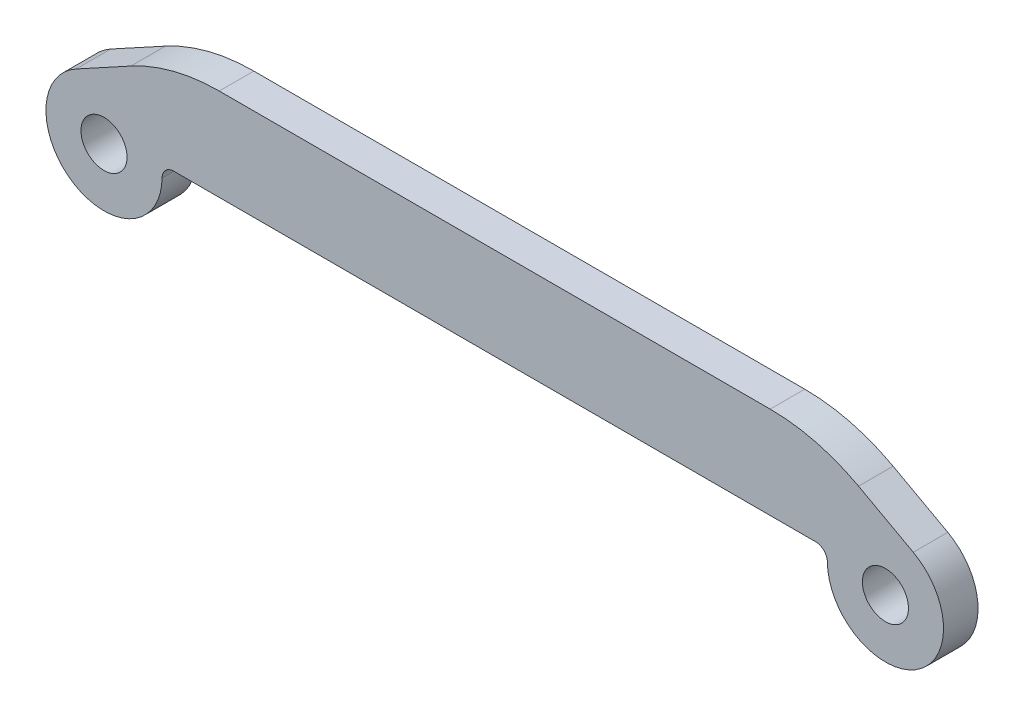
ISO-10303-21;
HEADER;
FILE_DESCRIPTION(('STEP AP214'),'2;1');
FILE_NAME('part.step','',(''),(''),'','','');
FILE_SCHEMA(('AUTOMOTIVE_DESIGN { 1 0 10303 214 1 1 1 1 }'));
ENDSEC;
DATA;
#1=APPLICATION_CONTEXT('core data for automotive mechanical design processes');
#2=APPLICATION_PROTOCOL_DEFINITION('international standard','automotive_design',2000,#1);
#3=PRODUCT_CONTEXT('',#1,'mechanical');
#4=PRODUCT('Part','Part','',(#3));
#5=PRODUCT_RELATED_PRODUCT_CATEGORY('part','',(#4));
#6=PRODUCT_DEFINITION_FORMATION('','',#4);
#7=PRODUCT_DEFINITION_CONTEXT('part definition',#1,'design');
#8=PRODUCT_DEFINITION('design','',#6,#7);
#9=PRODUCT_DEFINITION_SHAPE('','',#8);
#10=(LENGTH_UNIT() NAMED_UNIT(*) SI_UNIT(.MILLI.,.METRE.));
#11=(NAMED_UNIT(*) PLANE_ANGLE_UNIT() SI_UNIT($,.RADIAN.));
#12=(NAMED_UNIT(*) SI_UNIT($,.STERADIAN.) SOLID_ANGLE_UNIT());
#13=UNCERTAINTY_MEASURE_WITH_UNIT(LENGTH_MEASURE(1.E-05),#10,'distance_accuracy_value','');
#14=(GEOMETRIC_REPRESENTATION_CONTEXT(3) GLOBAL_UNCERTAINTY_ASSIGNED_CONTEXT((#13)) GLOBAL_UNIT_ASSIGNED_CONTEXT((#10,
#11,#12)) REPRESENTATION_CONTEXT('',''));
#15=CARTESIAN_POINT('',(0.,0.,0.));
#16=DIRECTION('',(0.,0.,1.));
#17=DIRECTION('',(1.,0.,0.));
#18=AXIS2_PLACEMENT_3D('',#15,#16,#17);
#19=CARTESIAN_POINT('',(-1.16378795180871E-13,-6.35000000000047,1.190625));
#20=DIRECTION('',(0.,1.,0.));
#21=DIRECTION('',(-1.,0.,0.));
#22=AXIS2_PLACEMENT_3D('',#19,#20,#21);
#23=PLANE('',#22);
#24=DIRECTION('',(1.,0.,0.));
#25=VECTOR('',#24,1.);
#26=CARTESIAN_POINT('',(-1.16378795180871E-13,-6.35000000000047,-1.190625));
#27=LINE('',#26,#25);
#28=CARTESIAN_POINT('',(-22.1108507939188,-6.35000000000006,-1.190625));
#29=VERTEX_POINT('',#28);
#30=CARTESIAN_POINT('',(22.1108507939189,-6.35000000000087,-1.190625));
#31=VERTEX_POINT('',#30);
#32=EDGE_CURVE('E171',#29,#31,#27,.T.);
#33=ORIENTED_EDGE('',*,*,#32,.T.);
#34=DIRECTION('',(0.,0.,-1.));
#35=VECTOR('',#34,1.);
#36=CARTESIAN_POINT('',(22.1108507939189,-6.35000000000087,1.190625));
#37=LINE('',#36,#35);
#38=CARTESIAN_POINT('',(22.1108507939189,-6.35000000000087,1.190625));
#39=VERTEX_POINT('',#38);
#40=EDGE_CURVE('E231',#31,#39,#37,.F.);
#41=ORIENTED_EDGE('',*,*,#40,.T.);
#42=DIRECTION('',(1.,0.,0.));
#43=VECTOR('',#42,1.);
#44=CARTESIAN_POINT('',(-1.16378795180871E-13,-6.35000000000047,1.190625));
#45=LINE('',#44,#43);
#46=CARTESIAN_POINT('',(-22.1108507939188,-6.35000000000006,1.190625));
#47=VERTEX_POINT('',#46);
#48=EDGE_CURVE('E148',#47,#39,#45,.T.);
#49=ORIENTED_EDGE('',*,*,#48,.F.);
#50=DIRECTION('',(0.,0.,1.));
#51=VECTOR('',#50,1.);
#52=CARTESIAN_POINT('',(-22.1108507939188,-6.35000000000006,-1.190625));
#53=LINE('',#52,#51);
#54=EDGE_CURVE('E227',#47,#29,#53,.F.);
#55=ORIENTED_EDGE('',*,*,#54,.T.);
#56=EDGE_LOOP('',(#33,#41,#49,#55));
#57=FACE_BOUND('',#56,.T.);
#58=ADVANCED_FACE('F38',(#57),#23,.F.);
#59=CARTESIAN_POINT('',(26.9240000000001,-7.12470000000089,1.190625));
#60=DIRECTION('',(0.,0.,-1.));
#61=DIRECTION('',(-1.,0.,0.));
#62=AXIS2_PLACEMENT_3D('',#59,#60,#61);
#63=CYLINDRICAL_SURFACE('',#62,4.00049999999999);
#64=CARTESIAN_POINT('',(26.9240000000001,-7.12470000000089,1.190625));
#65=DIRECTION('',(0.,0.,1.));
#66=DIRECTION('',(1.,0.,0.));
#67=AXIS2_PLACEMENT_3D('',#64,#65,#66);
#68=CIRCLE('',#67,4.00049999999999);
#69=CARTESIAN_POINT('',(28.8415655421229,-3.61372540002682,1.190625));
#70=VERTEX_POINT('',#69);
#71=CARTESIAN_POINT('',(22.9236253300381,-7.1563662269138,1.190625));
#72=VERTEX_POINT('',#71);
#73=EDGE_CURVE('E129',#70,#72,#68,.F.);
#74=ORIENTED_EDGE('',*,*,#73,.T.);
#75=DIRECTION('',(0.,0.,-1.));
#76=VECTOR('',#75,1.);
#77=CARTESIAN_POINT('',(22.9236253300381,-7.1563662269138,1.190625));
#78=LINE('',#77,#76);
#79=CARTESIAN_POINT('',(22.9236253300381,-7.1563662269138,-1.190625));
#80=VERTEX_POINT('',#79);
#81=EDGE_CURVE('E224',#72,#80,#78,.T.);
#82=ORIENTED_EDGE('',*,*,#81,.T.);
#83=CARTESIAN_POINT('',(26.9240000000001,-7.12470000000089,-1.190625));
#84=DIRECTION('',(0.,0.,1.));
#85=DIRECTION('',(1.,0.,0.));
#86=AXIS2_PLACEMENT_3D('',#83,#84,#85);
#87=CIRCLE('',#86,4.00049999999999);
#88=CARTESIAN_POINT('',(28.8415655421229,-3.61372540002682,-1.190625));
#89=VERTEX_POINT('',#88);
#90=EDGE_CURVE('E137',#89,#80,#87,.F.);
#91=ORIENTED_EDGE('',*,*,#90,.F.);
#92=DIRECTION('',(0.,0.,-1.));
#93=VECTOR('',#92,1.);
#94=CARTESIAN_POINT('',(28.8415655421229,-3.61372540002682,1.190625));
#95=LINE('',#94,#93);
#96=EDGE_CURVE('E120',#70,#89,#95,.T.);
#97=ORIENTED_EDGE('',*,*,#96,.F.);
#98=EDGE_LOOP('',(#74,#82,#91,#97));
#99=FACE_BOUND('',#98,.T.);
#100=ADVANCED_FACE('F133',(#99),#63,.T.);
#101=CARTESIAN_POINT('',(5.10638615775566,9.34955896093505,1.190625));
#102=DIRECTION('',(0.479331469097165,0.877633945750251,0.));
#103=DIRECTION('',(-0.877633945750251,0.479331469097165,0.));
#104=AXIS2_PLACEMENT_3D('',#101,#102,#103);
#105=PLANE('',#104);
#106=DIRECTION('',(0.877633945750251,-0.479331469097165,0.));
#107=VECTOR('',#106,1.);
#108=CARTESIAN_POINT('',(5.10638615775566,9.34955896093505,-1.190625));
#109=LINE('',#108,#107);
#110=CARTESIAN_POINT('',(25.0703922728797,-1.55404888897182,-1.190625));
#111=VERTEX_POINT('',#110);
#112=EDGE_CURVE('E177',#111,#89,#109,.T.);
#113=ORIENTED_EDGE('',*,*,#112,.F.);
#114=DIRECTION('',(0.,0.,-1.));
#115=VECTOR('',#114,1.);
#116=CARTESIAN_POINT('',(25.0703922728797,-1.55404888897182,1.190625));
#117=LINE('',#116,#115);
#118=CARTESIAN_POINT('',(25.0703922728797,-1.55404888897182,1.190625));
#119=VERTEX_POINT('',#118);
#120=EDGE_CURVE('E123',#111,#119,#117,.F.);
#121=ORIENTED_EDGE('',*,*,#120,.T.);
#122=DIRECTION('',(0.877633945750251,-0.479331469097165,0.));
#123=VECTOR('',#122,1.);
#124=CARTESIAN_POINT('',(5.10638615775566,9.34955896093505,1.190625));
#125=LINE('',#124,#123);
#126=EDGE_CURVE('E116',#119,#70,#125,.T.);
#127=ORIENTED_EDGE('',*,*,#126,.T.);
#128=ORIENTED_EDGE('',*,*,#96,.T.);
#129=EDGE_LOOP('',(#113,#121,#127,#128));
#130=FACE_BOUND('',#129,.T.);
#131=ADVANCED_FACE('F119',(#130),#105,.T.);
#132=CARTESIAN_POINT('',(0.,0.,1.190625));
#133=DIRECTION('',(0.,1.,0.));
#134=DIRECTION('',(0.,0.,1.));
#135=AXIS2_PLACEMENT_3D('',#132,#133,#134);
#136=PLANE('',#135);
#137=DIRECTION('',(1.,0.,0.));
#138=VECTOR('',#137,1.);
#139=CARTESIAN_POINT('',(0.,0.,1.190625));
#140=LINE('',#139,#138);
#141=CARTESIAN_POINT('',(-18.9828826153464,0.,1.190625));
#142=VERTEX_POINT('',#141);
#143=CARTESIAN_POINT('',(18.9828826153457,0.,1.190625));
#144=VERTEX_POINT('',#143);
#145=EDGE_CURVE('E128',#142,#144,#140,.T.);
#146=ORIENTED_EDGE('',*,*,#145,.T.);
#147=DIRECTION('',(0.,0.,-1.));
#148=VECTOR('',#147,1.);
#149=CARTESIAN_POINT('',(18.9828826153457,0.,1.190625));
#150=LINE('',#149,#148);
#151=CARTESIAN_POINT('',(18.9828826153457,0.,-1.190625));
#152=VERTEX_POINT('',#151);
#153=EDGE_CURVE('E202',#144,#152,#150,.T.);
#154=ORIENTED_EDGE('',*,*,#153,.T.);
#155=DIRECTION('',(1.,0.,0.));
#156=VECTOR('',#155,1.);
#157=CARTESIAN_POINT('',(0.,0.,-1.190625));
#158=LINE('',#157,#156);
#159=CARTESIAN_POINT('',(-18.9828826153464,0.,-1.190625));
#160=VERTEX_POINT('',#159);
#161=EDGE_CURVE('E180',#160,#152,#158,.T.);
#162=ORIENTED_EDGE('',*,*,#161,.F.);
#163=DIRECTION('',(0.,0.,-1.));
#164=VECTOR('',#163,1.);
#165=CARTESIAN_POINT('',(-18.9828826153464,0.,1.190625));
#166=LINE('',#165,#164);
#167=EDGE_CURVE('E139',#160,#142,#166,.F.);
#168=ORIENTED_EDGE('',*,*,#167,.T.);
#169=EDGE_LOOP('',(#146,#154,#162,#168));
#170=FACE_BOUND('',#169,.T.);
#171=ADVANCED_FACE('F277',(#170),#136,.T.);
#172=CARTESIAN_POINT('',(-5.10638615775375,9.34955896093382,1.190625));
#173=DIRECTION('',(0.479331469097075,-0.8776339457503,0.));
#174=DIRECTION('',(0.8776339457503,0.479331469097075,0.));
#175=AXIS2_PLACEMENT_3D('',#172,#173,#174);
#176=PLANE('',#175);
#177=DIRECTION('',(-0.8776339457503,-0.479331469097075,0.));
#178=VECTOR('',#177,1.);
#179=CARTESIAN_POINT('',(-5.10638615775375,9.34955896093382,1.190625));
#180=LINE('',#179,#178);
#181=CARTESIAN_POINT('',(-25.0703922728792,-1.5540488889712,1.190625));
#182=VERTEX_POINT('',#181);
#183=CARTESIAN_POINT('',(-28.8415655421229,-3.61372540002593,1.190625));
#184=VERTEX_POINT('',#183);
#185=EDGE_CURVE('E157',#182,#184,#180,.T.);
#186=ORIENTED_EDGE('',*,*,#185,.F.);
#187=DIRECTION('',(0.,0.,-1.));
#188=VECTOR('',#187,1.);
#189=CARTESIAN_POINT('',(-25.0703922728792,-1.55404888897119,-1.190625));
#190=LINE('',#189,#188);
#191=CARTESIAN_POINT('',(-25.0703922728792,-1.5540488889712,-1.190625));
#192=VERTEX_POINT('',#191);
#193=EDGE_CURVE('E220',#182,#192,#190,.T.);
#194=ORIENTED_EDGE('',*,*,#193,.T.);
#195=DIRECTION('',(-0.8776339457503,-0.479331469097075,0.));
#196=VECTOR('',#195,1.);
#197=CARTESIAN_POINT('',(-5.10638615775375,9.34955896093382,-1.190625));
#198=LINE('',#197,#196);
#199=CARTESIAN_POINT('',(-28.8415655421229,-3.61372540002593,-1.190625));
#200=VERTEX_POINT('',#199);
#201=EDGE_CURVE('E184',#192,#200,#198,.T.);
#202=ORIENTED_EDGE('',*,*,#201,.T.);
#203=DIRECTION('',(0.,0.,-1.));
#204=VECTOR('',#203,1.);
#205=CARTESIAN_POINT('',(-28.8415655421229,-3.61372540002593,1.190625));
#206=LINE('',#205,#204);
#207=EDGE_CURVE('E140',#184,#200,#206,.T.);
#208=ORIENTED_EDGE('',*,*,#207,.F.);
#209=EDGE_LOOP('',(#186,#194,#202,#208));
#210=FACE_BOUND('',#209,.T.);
#211=ADVANCED_FACE('F284',(#210),#176,.F.);
#212=CARTESIAN_POINT('',(-26.924,-7.1247,1.190625));
#213=DIRECTION('',(0.,0.,-1.));
#214=DIRECTION('',(-1.,0.,0.));
#215=AXIS2_PLACEMENT_3D('',#212,#213,#214);
#216=CYLINDRICAL_SURFACE('',#215,1.5875);
#217=CARTESIAN_POINT('',(-26.924,-7.1247,1.190625));
#218=DIRECTION('',(0.,0.,1.));
#219=DIRECTION('',(1.,0.,0.));
#220=AXIS2_PLACEMENT_3D('',#217,#218,#219);
#221=CIRCLE('',#220,1.5875);
#222=CARTESIAN_POINT('',(-28.5115,-7.1247,1.190625));
#223=VERTEX_POINT('',#222);
#224=EDGE_CURVE('E163',#223,#223,#221,.T.);
#225=CARTESIAN_POINT('',(-26.924,-7.1247,-1.190625));
#226=DIRECTION('',(0.,0.,1.));
#227=DIRECTION('',(1.,0.,0.));
#228=AXIS2_PLACEMENT_3D('',#225,#226,#227);
#229=CIRCLE('',#228,1.5875);
#230=CARTESIAN_POINT('',(-28.5115,-7.1247,-1.190625));
#231=VERTEX_POINT('',#230);
#232=EDGE_CURVE('E190',#231,#231,#229,.T.);
#233=CARTESIAN_POINT('',(-28.5115,-7.1247,1.190625));
#234=CARTESIAN_POINT('',(-28.5115,-7.1247,1.1658203125));
#235=CARTESIAN_POINT('',(-28.5115,-7.1247,1.141015625));
#236=CARTESIAN_POINT('',(-28.5115,-7.1247,1.09140625));
#237=CARTESIAN_POINT('',(-28.5115,-7.1247,1.0666015625));
#238=CARTESIAN_POINT('',(-28.5115,-7.1247,1.0169921875));
#239=CARTESIAN_POINT('',(-28.5115,-7.1247,0.9921875));
#240=CARTESIAN_POINT('',(-28.5115,-7.1247,0.942578125));
#241=CARTESIAN_POINT('',(-28.5115,-7.1247,0.9177734375));
#242=CARTESIAN_POINT('',(-28.5115,-7.1247,0.8681640625));
#243=CARTESIAN_POINT('',(-28.5115,-7.1247,0.843359375));
#244=CARTESIAN_POINT('',(-28.5115,-7.1247,0.79375));
#245=CARTESIAN_POINT('',(-28.5115,-7.1247,0.7689453125));
#246=CARTESIAN_POINT('',(-28.5115,-7.1247,0.7193359375));
#247=CARTESIAN_POINT('',(-28.5115,-7.1247,0.69453125));
#248=CARTESIAN_POINT('',(-28.5115,-7.1247,0.644921875));
#249=CARTESIAN_POINT('',(-28.5115,-7.1247,0.6201171875));
#250=CARTESIAN_POINT('',(-28.5115,-7.1247,0.5705078125));
#251=CARTESIAN_POINT('',(-28.5115,-7.1247,0.545703125));
#252=CARTESIAN_POINT('',(-28.5115,-7.1247,0.49609375));
#253=CARTESIAN_POINT('',(-28.5115,-7.1247,0.4712890625));
#254=CARTESIAN_POINT('',(-28.5115,-7.1247,0.4216796875));
#255=CARTESIAN_POINT('',(-28.5115,-7.1247,0.396875));
#256=CARTESIAN_POINT('',(-28.5115,-7.1247,0.347265625));
#257=CARTESIAN_POINT('',(-28.5115,-7.1247,0.3224609375));
#258=CARTESIAN_POINT('',(-28.5115,-7.1247,0.2728515625));
#259=CARTESIAN_POINT('',(-28.5115,-7.1247,0.248046875));
#260=CARTESIAN_POINT('',(-28.5115,-7.1247,0.1984375));
#261=CARTESIAN_POINT('',(-28.5115,-7.1247,0.1736328125));
#262=CARTESIAN_POINT('',(-28.5115,-7.1247,0.1240234375));
#263=CARTESIAN_POINT('',(-28.5115,-7.1247,0.0992187499999998));
#264=CARTESIAN_POINT('',(-28.5115,-7.1247,0.0496093749999998));
#265=CARTESIAN_POINT('',(-28.5115,-7.1247,0.0248046874999998));
#266=CARTESIAN_POINT('',(-28.5115,-7.1247,-0.0248046875000002));
#267=CARTESIAN_POINT('',(-28.5115,-7.1247,-0.0496093750000002));
#268=CARTESIAN_POINT('',(-28.5115,-7.1247,-0.0992187500000003));
#269=CARTESIAN_POINT('',(-28.5115,-7.1247,-0.1240234375));
#270=CARTESIAN_POINT('',(-28.5115,-7.1247,-0.1736328125));
#271=CARTESIAN_POINT('',(-28.5115,-7.1247,-0.1984375));
#272=CARTESIAN_POINT('',(-28.5115,-7.1247,-0.248046875));
#273=CARTESIAN_POINT('',(-28.5115,-7.1247,-0.2728515625));
#274=CARTESIAN_POINT('',(-28.5115,-7.1247,-0.3224609375));
#275=CARTESIAN_POINT('',(-28.5115,-7.1247,-0.347265625));
#276=CARTESIAN_POINT('',(-28.5115,-7.1247,-0.396875));
#277=CARTESIAN_POINT('',(-28.5115,-7.1247,-0.4216796875));
#278=CARTESIAN_POINT('',(-28.5115,-7.1247,-0.4712890625));
#279=CARTESIAN_POINT('',(-28.5115,-7.1247,-0.49609375));
#280=CARTESIAN_POINT('',(-28.5115,-7.1247,-0.545703125));
#281=CARTESIAN_POINT('',(-28.5115,-7.1247,-0.5705078125));
#282=CARTESIAN_POINT('',(-28.5115,-7.1247,-0.6201171875));
#283=CARTESIAN_POINT('',(-28.5115,-7.1247,-0.644921875));
#284=CARTESIAN_POINT('',(-28.5115,-7.1247,-0.69453125));
#285=CARTESIAN_POINT('',(-28.5115,-7.1247,-0.7193359375));
#286=CARTESIAN_POINT('',(-28.5115,-7.1247,-0.7689453125));
#287=CARTESIAN_POINT('',(-28.5115,-7.1247,-0.79375));
#288=CARTESIAN_POINT('',(-28.5115,-7.1247,-0.843359375));
#289=CARTESIAN_POINT('',(-28.5115,-7.1247,-0.8681640625));
#290=CARTESIAN_POINT('',(-28.5115,-7.1247,-0.9177734375));
#291=CARTESIAN_POINT('',(-28.5115,-7.1247,-0.942578125));
#292=CARTESIAN_POINT('',(-28.5115,-7.1247,-0.9921875));
#293=CARTESIAN_POINT('',(-28.5115,-7.1247,-1.0169921875));
#294=CARTESIAN_POINT('',(-28.5115,-7.1247,-1.0666015625));
#295=CARTESIAN_POINT('',(-28.5115,-7.1247,-1.09140625));
#296=CARTESIAN_POINT('',(-28.5115,-7.1247,-1.141015625));
#297=CARTESIAN_POINT('',(-28.5115,-7.1247,-1.1658203125));
#298=CARTESIAN_POINT('',(-28.5115,-7.1247,-1.190625));
#299=B_SPLINE_CURVE_WITH_KNOTS('',3,(#233,#234,#235,#236,#237,#238,#239,#240,#241,#242,#243,
#244,#245,#246,#247,#248,#249,#250,#251,#252,#253,#254,#255,#256,#257,#258,#259,#260,#261,#262,
#263,#264,#265,#266,#267,#268,#269,#270,#271,#272,#273,#274,#275,#276,#277,#278,#279,#280,#281,
#282,#283,#284,#285,#286,#287,#288,#289,#290,#291,#292,#293,#294,#295,#296,#297,#298),
.UNSPECIFIED.,.F.,.F.,(4,2,2,2,2,2,2,2,2,2,2,2,2,2,2,2,2,2,2,2,2,2,2,2,2,2,2,2,2,2,2,2,4),(0.,
0.0744140624999998,0.148828125,0.2232421875,0.29765625,0.3720703125,0.446484375,0.5208984375,
0.5953125,0.6697265625,0.744140625,0.8185546875,0.89296875,0.9673828125,1.041796875,
1.1162109375,1.190625,1.2650390625,1.339453125,1.4138671875,1.48828125,1.5626953125,1.637109375,
1.7115234375,1.7859375,1.8603515625,1.934765625,2.0091796875,2.08359375,2.1580078125,
2.232421875,2.3068359375,2.38125),.UNSPECIFIED.);
#300=EDGE_CURVE('BSEAM290',#223,#231,#299,.T.);
#301=ORIENTED_EDGE('',*,*,#224,.T.);
#302=ORIENTED_EDGE('',*,*,#232,.F.);
#303=ORIENTED_EDGE('',*,*,#300,.T.);
#304=ORIENTED_EDGE('',*,*,#300,.F.);
#305=EDGE_LOOP('',(#301,#303,#302,#304));
#306=FACE_BOUND('',#305,.T.);
#307=ADVANCED_FACE('F290',(#306),#216,.F.);
#308=CARTESIAN_POINT('',(-26.924,-7.1247,1.190625));
#309=DIRECTION('',(0.,0.,-1.));
#310=DIRECTION('',(-1.,0.,0.));
#311=AXIS2_PLACEMENT_3D('',#308,#309,#310);
#312=CYLINDRICAL_SURFACE('',#311,4.0005);
#313=CARTESIAN_POINT('',(-26.924,-7.1247,-1.190625));
#314=DIRECTION('',(0.,0.,1.));
#315=DIRECTION('',(1.,0.,0.));
#316=AXIS2_PLACEMENT_3D('',#313,#314,#315);
#317=CIRCLE('',#316,4.0005);
#318=CARTESIAN_POINT('',(-22.9236253300381,-7.15636622691298,-1.190625));
#319=VERTEX_POINT('',#318);
#320=EDGE_CURVE('E187',#200,#319,#317,.T.);
#321=ORIENTED_EDGE('',*,*,#320,.T.);
#322=DIRECTION('',(0.,0.,-1.));
#323=VECTOR('',#322,1.);
#324=CARTESIAN_POINT('',(-22.9236253300381,-7.15636622691298,1.190625));
#325=LINE('',#324,#323);
#326=CARTESIAN_POINT('',(-22.9236253300381,-7.15636622691298,1.190625));
#327=VERTEX_POINT('',#326);
#328=EDGE_CURVE('E54',#319,#327,#325,.F.);
#329=ORIENTED_EDGE('',*,*,#328,.T.);
#330=CARTESIAN_POINT('',(-26.924,-7.1247,1.190625));
#331=DIRECTION('',(0.,0.,1.));
#332=DIRECTION('',(1.,0.,0.));
#333=AXIS2_PLACEMENT_3D('',#330,#331,#332);
#334=CIRCLE('',#333,4.0005);
#335=EDGE_CURVE('E160',#184,#327,#334,.T.);
#336=ORIENTED_EDGE('',*,*,#335,.F.);
#337=ORIENTED_EDGE('',*,*,#207,.T.);
#338=EDGE_LOOP('',(#321,#329,#336,#337));
#339=FACE_BOUND('',#338,.T.);
#340=ADVANCED_FACE('F286',(#339),#312,.T.);
#341=CARTESIAN_POINT('',(26.9240000000001,-7.12470000000089,1.190625));
#342=DIRECTION('',(0.,0.,-1.));
#343=DIRECTION('',(-1.,0.,0.));
#344=AXIS2_PLACEMENT_3D('',#341,#342,#343);
#345=CYLINDRICAL_SURFACE('',#344,1.58750000000001);
#346=CARTESIAN_POINT('',(26.9240000000001,-7.12470000000089,1.190625));
#347=DIRECTION('',(0.,0.,1.));
#348=DIRECTION('',(1.,0.,0.));
#349=AXIS2_PLACEMENT_3D('',#346,#347,#348);
#350=CIRCLE('',#349,1.58750000000001);
#351=CARTESIAN_POINT('',(25.3365000000001,-7.12470000000089,1.190625));
#352=VERTEX_POINT('',#351);
#353=EDGE_CURVE('E167',#352,#352,#350,.F.);
#354=CARTESIAN_POINT('',(26.9240000000001,-7.12470000000089,-1.190625));
#355=DIRECTION('',(0.,0.,1.));
#356=DIRECTION('',(1.,0.,0.));
#357=AXIS2_PLACEMENT_3D('',#354,#355,#356);
#358=CIRCLE('',#357,1.58750000000001);
#359=CARTESIAN_POINT('',(25.3365000000001,-7.12470000000089,-1.190625));
#360=VERTEX_POINT('',#359);
#361=EDGE_CURVE('E151',#360,#360,#358,.F.);
#362=CARTESIAN_POINT('',(25.3365000000001,-7.12470000000089,1.190625));
#363=CARTESIAN_POINT('',(25.3365000000001,-7.12470000000089,1.1658203125));
#364=CARTESIAN_POINT('',(25.3365000000001,-7.12470000000089,1.141015625));
#365=CARTESIAN_POINT('',(25.3365000000001,-7.12470000000089,1.09140625));
#366=CARTESIAN_POINT('',(25.3365000000001,-7.12470000000089,1.0666015625));
#367=CARTESIAN_POINT('',(25.3365000000001,-7.12470000000089,1.0169921875));
#368=CARTESIAN_POINT('',(25.3365000000001,-7.12470000000089,0.9921875));
#369=CARTESIAN_POINT('',(25.3365000000001,-7.12470000000089,0.942578125));
#370=CARTESIAN_POINT('',(25.3365000000001,-7.12470000000089,0.9177734375));
#371=CARTESIAN_POINT('',(25.3365000000001,-7.12470000000089,0.8681640625));
#372=CARTESIAN_POINT('',(25.3365000000001,-7.12470000000089,0.843359375));
#373=CARTESIAN_POINT('',(25.3365000000001,-7.12470000000089,0.79375));
#374=CARTESIAN_POINT('',(25.3365000000001,-7.12470000000089,0.7689453125));
#375=CARTESIAN_POINT('',(25.3365000000001,-7.12470000000089,0.7193359375));
#376=CARTESIAN_POINT('',(25.3365000000001,-7.12470000000089,0.69453125));
#377=CARTESIAN_POINT('',(25.3365000000001,-7.12470000000089,0.644921875));
#378=CARTESIAN_POINT('',(25.3365000000001,-7.12470000000089,0.6201171875));
#379=CARTESIAN_POINT('',(25.3365000000001,-7.12470000000089,0.5705078125));
#380=CARTESIAN_POINT('',(25.3365000000001,-7.12470000000089,0.545703125));
#381=CARTESIAN_POINT('',(25.3365000000001,-7.12470000000089,0.49609375));
#382=CARTESIAN_POINT('',(25.3365000000001,-7.12470000000089,0.4712890625));
#383=CARTESIAN_POINT('',(25.3365000000001,-7.12470000000089,0.4216796875));
#384=CARTESIAN_POINT('',(25.3365000000001,-7.12470000000089,0.396875));
#385=CARTESIAN_POINT('',(25.3365000000001,-7.12470000000089,0.347265625));
#386=CARTESIAN_POINT('',(25.3365000000001,-7.12470000000089,0.3224609375));
#387=CARTESIAN_POINT('',(25.3365000000001,-7.12470000000089,0.2728515625));
#388=CARTESIAN_POINT('',(25.3365000000001,-7.12470000000089,0.248046875));
#389=CARTESIAN_POINT('',(25.3365000000001,-7.12470000000089,0.1984375));
#390=CARTESIAN_POINT('',(25.3365000000001,-7.12470000000089,0.1736328125));
#391=CARTESIAN_POINT('',(25.3365000000001,-7.12470000000089,0.1240234375));
#392=CARTESIAN_POINT('',(25.3365000000001,-7.12470000000089,0.0992187499999998));
#393=CARTESIAN_POINT('',(25.3365000000001,-7.12470000000089,0.0496093749999998));
#394=CARTESIAN_POINT('',(25.3365000000001,-7.12470000000089,0.0248046874999998));
#395=CARTESIAN_POINT('',(25.3365000000001,-7.12470000000089,-0.0248046875000002));
#396=CARTESIAN_POINT('',(25.3365000000001,-7.12470000000089,-0.0496093750000002));
#397=CARTESIAN_POINT('',(25.3365000000001,-7.12470000000089,-0.0992187500000003));
#398=CARTESIAN_POINT('',(25.3365000000001,-7.12470000000089,-0.1240234375));
#399=CARTESIAN_POINT('',(25.3365000000001,-7.12470000000089,-0.1736328125));
#400=CARTESIAN_POINT('',(25.3365000000001,-7.12470000000089,-0.1984375));
#401=CARTESIAN_POINT('',(25.3365000000001,-7.12470000000089,-0.248046875));
#402=CARTESIAN_POINT('',(25.3365000000001,-7.12470000000089,-0.2728515625));
#403=CARTESIAN_POINT('',(25.3365000000001,-7.12470000000089,-0.3224609375));
#404=CARTESIAN_POINT('',(25.3365000000001,-7.12470000000089,-0.347265625));
#405=CARTESIAN_POINT('',(25.3365000000001,-7.12470000000089,-0.396875));
#406=CARTESIAN_POINT('',(25.3365000000001,-7.12470000000089,-0.4216796875));
#407=CARTESIAN_POINT('',(25.3365000000001,-7.12470000000089,-0.4712890625));
#408=CARTESIAN_POINT('',(25.3365000000001,-7.12470000000089,-0.49609375));
#409=CARTESIAN_POINT('',(25.3365000000001,-7.12470000000089,-0.545703125));
#410=CARTESIAN_POINT('',(25.3365000000001,-7.12470000000089,-0.5705078125));
#411=CARTESIAN_POINT('',(25.3365000000001,-7.12470000000089,-0.6201171875));
#412=CARTESIAN_POINT('',(25.3365000000001,-7.12470000000089,-0.644921875));
#413=CARTESIAN_POINT('',(25.3365000000001,-7.12470000000089,-0.69453125));
#414=CARTESIAN_POINT('',(25.3365000000001,-7.12470000000089,-0.7193359375));
#415=CARTESIAN_POINT('',(25.3365000000001,-7.12470000000089,-0.7689453125));
#416=CARTESIAN_POINT('',(25.3365000000001,-7.12470000000089,-0.79375));
#417=CARTESIAN_POINT('',(25.3365000000001,-7.12470000000089,-0.843359375));
#418=CARTESIAN_POINT('',(25.3365000000001,-7.12470000000089,-0.8681640625));
#419=CARTESIAN_POINT('',(25.3365000000001,-7.12470000000089,-0.9177734375));
#420=CARTESIAN_POINT('',(25.3365000000001,-7.12470000000089,-0.942578125));
#421=CARTESIAN_POINT('',(25.3365000000001,-7.12470000000089,-0.9921875));
#422=CARTESIAN_POINT('',(25.3365000000001,-7.12470000000089,-1.0169921875));
#423=CARTESIAN_POINT('',(25.3365000000001,-7.12470000000089,-1.0666015625));
#424=CARTESIAN_POINT('',(25.3365000000001,-7.12470000000089,-1.09140625));
#425=CARTESIAN_POINT('',(25.3365000000001,-7.12470000000089,-1.141015625));
#426=CARTESIAN_POINT('',(25.3365000000001,-7.12470000000089,-1.1658203125));
#427=CARTESIAN_POINT('',(25.3365000000001,-7.12470000000089,-1.190625));
#428=B_SPLINE_CURVE_WITH_KNOTS('',3,(#362,#363,#364,#365,#366,#367,#368,#369,#370,#371,#372,
#373,#374,#375,#376,#377,#378,#379,#380,#381,#382,#383,#384,#385,#386,#387,#388,#389,#390,#391,
#392,#393,#394,#395,#396,#397,#398,#399,#400,#401,#402,#403,#404,#405,#406,#407,#408,#409,#410,
#411,#412,#413,#414,#415,#416,#417,#418,#419,#420,#421,#422,#423,#424,#425,#426,#427),
.UNSPECIFIED.,.F.,.F.,(4,2,2,2,2,2,2,2,2,2,2,2,2,2,2,2,2,2,2,2,2,2,2,2,2,2,2,2,2,2,2,2,4),(0.,
0.0744140624999998,0.148828125,0.2232421875,0.29765625,0.3720703125,0.446484375,0.5208984375,
0.5953125,0.6697265625,0.744140625,0.8185546875,0.89296875,0.9673828125,1.041796875,
1.1162109375,1.190625,1.2650390625,1.339453125,1.4138671875,1.48828125,1.5626953125,1.637109375,
1.7115234375,1.7859375,1.8603515625,1.934765625,2.0091796875,2.08359375,2.1580078125,
2.232421875,2.3068359375,2.38125),.UNSPECIFIED.);
#429=EDGE_CURVE('BSEAM289',#352,#360,#428,.T.);
#430=ORIENTED_EDGE('',*,*,#353,.F.);
#431=ORIENTED_EDGE('',*,*,#361,.T.);
#432=ORIENTED_EDGE('',*,*,#429,.T.);
#433=ORIENTED_EDGE('',*,*,#429,.F.);
#434=EDGE_LOOP('',(#430,#432,#431,#433));
#435=FACE_BOUND('',#434,.T.);
#436=ADVANCED_FACE('F289',(#435),#345,.F.);
#437=CARTESIAN_POINT('',(0.,0.,1.190625));
#438=DIRECTION('',(0.,0.,1.));
#439=DIRECTION('',(1.,0.,0.));
#440=AXIS2_PLACEMENT_3D('',#437,#438,#439);
#441=PLANE('',#440);
#442=ORIENTED_EDGE('',*,*,#126,.F.);
#443=CARTESIAN_POINT('',(18.9828826153457,-12.7,1.190625));
#444=DIRECTION('',(0.,0.,1.));
#445=DIRECTION('',(1.,0.,0.));
#446=AXIS2_PLACEMENT_3D('',#443,#444,#445);
#447=CIRCLE('',#446,12.7);
#448=EDGE_CURVE('E217',#119,#144,#447,.T.);
#449=ORIENTED_EDGE('',*,*,#448,.T.);
#450=ORIENTED_EDGE('',*,*,#145,.F.);
#451=CARTESIAN_POINT('',(-18.9828826153464,-12.7,1.190625));
#452=DIRECTION('',(0.,0.,1.));
#453=DIRECTION('',(1.,0.,0.));
#454=AXIS2_PLACEMENT_3D('',#451,#452,#453);
#455=CIRCLE('',#454,12.7);
#456=EDGE_CURVE('E214',#142,#182,#455,.T.);
#457=ORIENTED_EDGE('',*,*,#456,.T.);
#458=ORIENTED_EDGE('',*,*,#185,.T.);
#459=ORIENTED_EDGE('',*,*,#335,.T.);
#460=CARTESIAN_POINT('',(-22.1108507939188,-7.16280000000006,1.190625));
#461=DIRECTION('',(0.,0.,1.));
#462=DIRECTION('',(1.,0.,0.));
#463=AXIS2_PLACEMENT_3D('',#460,#461,#462);
#464=CIRCLE('',#463,0.8128);
#465=EDGE_CURVE('E11',#327,#47,#464,.F.);
#466=ORIENTED_EDGE('',*,*,#465,.T.);
#467=ORIENTED_EDGE('',*,*,#48,.T.);
#468=CARTESIAN_POINT('',(22.1108507939189,-7.16280000000087,1.190625));
#469=DIRECTION('',(0.,0.,1.));
#470=DIRECTION('',(1.,0.,0.));
#471=AXIS2_PLACEMENT_3D('',#468,#469,#470);
#472=CIRCLE('',#471,0.8128);
#473=EDGE_CURVE('E146',#39,#72,#472,.F.);
#474=ORIENTED_EDGE('',*,*,#473,.T.);
#475=ORIENTED_EDGE('',*,*,#73,.F.);
#476=EDGE_LOOP('',(#442,#449,#450,#457,#458,#459,#466,#467,#474,#475));
#477=FACE_BOUND('',#476,.T.);
#478=ORIENTED_EDGE('',*,*,#224,.F.);
#479=EDGE_LOOP('',(#478));
#480=FACE_BOUND('',#479,.T.);
#481=ORIENTED_EDGE('',*,*,#353,.T.);
#482=EDGE_LOOP('',(#481));
#483=FACE_BOUND('',#482,.T.);
#484=ADVANCED_FACE('F142',(#477,#480,#483),#441,.T.);
#485=CARTESIAN_POINT('',(0.,0.,-1.190625));
#486=DIRECTION('',(0.,0.,1.));
#487=DIRECTION('',(1.,0.,0.));
#488=AXIS2_PLACEMENT_3D('',#485,#486,#487);
#489=PLANE('',#488);
#490=ORIENTED_EDGE('',*,*,#161,.T.);
#491=CARTESIAN_POINT('',(18.9828826153457,-12.7,-1.190625));
#492=DIRECTION('',(0.,0.,1.));
#493=DIRECTION('',(1.,0.,0.));
#494=AXIS2_PLACEMENT_3D('',#491,#492,#493);
#495=CIRCLE('',#494,12.7);
#496=EDGE_CURVE('E209',#152,#111,#495,.F.);
#497=ORIENTED_EDGE('',*,*,#496,.T.);
#498=ORIENTED_EDGE('',*,*,#112,.T.);
#499=ORIENTED_EDGE('',*,*,#90,.T.);
#500=CARTESIAN_POINT('',(22.1108507939189,-7.16280000000087,-1.190625));
#501=DIRECTION('',(0.,0.,1.));
#502=DIRECTION('',(1.,0.,0.));
#503=AXIS2_PLACEMENT_3D('',#500,#501,#502);
#504=CIRCLE('',#503,0.8128);
#505=EDGE_CURVE('E236',#80,#31,#504,.T.);
#506=ORIENTED_EDGE('',*,*,#505,.T.);
#507=ORIENTED_EDGE('',*,*,#32,.F.);
#508=CARTESIAN_POINT('',(-22.1108507939188,-7.16280000000006,-1.190625));
#509=DIRECTION('',(0.,0.,1.));
#510=DIRECTION('',(1.,0.,0.));
#511=AXIS2_PLACEMENT_3D('',#508,#509,#510);
#512=CIRCLE('',#511,0.8128);
#513=EDGE_CURVE('E47',#29,#319,#512,.T.);
#514=ORIENTED_EDGE('',*,*,#513,.T.);
#515=ORIENTED_EDGE('',*,*,#320,.F.);
#516=ORIENTED_EDGE('',*,*,#201,.F.);
#517=CARTESIAN_POINT('',(-18.9828826153464,-12.7,-1.190625));
#518=DIRECTION('',(0.,0.,1.));
#519=DIRECTION('',(1.,0.,0.));
#520=AXIS2_PLACEMENT_3D('',#517,#518,#519);
#521=CIRCLE('',#520,12.7);
#522=EDGE_CURVE('E206',#192,#160,#521,.F.);
#523=ORIENTED_EDGE('',*,*,#522,.T.);
#524=EDGE_LOOP('',(#490,#497,#498,#499,#506,#507,#514,#515,#516,#523));
#525=FACE_BOUND('',#524,.T.);
#526=ORIENTED_EDGE('',*,*,#232,.T.);
#527=EDGE_LOOP('',(#526));
#528=FACE_BOUND('',#527,.T.);
#529=ORIENTED_EDGE('',*,*,#361,.F.);
#530=EDGE_LOOP('',(#529));
#531=FACE_BOUND('',#530,.T.);
#532=ADVANCED_FACE('F241',(#525,#528,#531),#489,.F.);
#533=CARTESIAN_POINT('',(18.9828826153457,-12.7,1.190625));
#534=DIRECTION('',(0.,0.,-1.));
#535=DIRECTION('',(-1.,0.,0.));
#536=AXIS2_PLACEMENT_3D('',#533,#534,#535);
#537=CYLINDRICAL_SURFACE('',#536,12.7);
#538=ORIENTED_EDGE('',*,*,#448,.F.);
#539=ORIENTED_EDGE('',*,*,#120,.F.);
#540=ORIENTED_EDGE('',*,*,#496,.F.);
#541=ORIENTED_EDGE('',*,*,#153,.F.);
#542=EDGE_LOOP('',(#538,#539,#540,#541));
#543=FACE_BOUND('',#542,.T.);
#544=ADVANCED_FACE('F256',(#543),#537,.T.);
#545=CARTESIAN_POINT('',(-18.9828826153464,-12.7,1.190625));
#546=DIRECTION('',(0.,0.,1.));
#547=DIRECTION('',(1.,0.,0.));
#548=AXIS2_PLACEMENT_3D('',#545,#546,#547);
#549=CYLINDRICAL_SURFACE('',#548,12.7);
#550=ORIENTED_EDGE('',*,*,#456,.F.);
#551=ORIENTED_EDGE('',*,*,#167,.F.);
#552=ORIENTED_EDGE('',*,*,#522,.F.);
#553=ORIENTED_EDGE('',*,*,#193,.F.);
#554=EDGE_LOOP('',(#550,#551,#552,#553));
#555=FACE_BOUND('',#554,.T.);
#556=ADVANCED_FACE('F250',(#555),#549,.T.);
#557=CARTESIAN_POINT('',(22.1108507939189,-7.16280000000087,1.190625));
#558=DIRECTION('',(0.,0.,-1.));
#559=DIRECTION('',(-1.,0.,0.));
#560=AXIS2_PLACEMENT_3D('',#557,#558,#559);
#561=CYLINDRICAL_SURFACE('',#560,0.8128);
#562=ORIENTED_EDGE('',*,*,#473,.F.);
#563=ORIENTED_EDGE('',*,*,#40,.F.);
#564=ORIENTED_EDGE('',*,*,#505,.F.);
#565=ORIENTED_EDGE('',*,*,#81,.F.);
#566=EDGE_LOOP('',(#562,#563,#564,#565));
#567=FACE_BOUND('',#566,.T.);
#568=ADVANCED_FACE('F248',(#567),#561,.F.);
#569=CARTESIAN_POINT('',(-22.1108507939188,-7.16280000000006,1.190625));
#570=DIRECTION('',(0.,0.,-1.));
#571=DIRECTION('',(-1.,0.,0.));
#572=AXIS2_PLACEMENT_3D('',#569,#570,#571);
#573=CYLINDRICAL_SURFACE('',#572,0.8128);
#574=ORIENTED_EDGE('',*,*,#465,.F.);
#575=ORIENTED_EDGE('',*,*,#328,.F.);
#576=ORIENTED_EDGE('',*,*,#513,.F.);
#577=ORIENTED_EDGE('',*,*,#54,.F.);
#578=EDGE_LOOP('',(#574,#575,#576,#577));
#579=FACE_BOUND('',#578,.T.);
#580=ADVANCED_FACE('F40',(#579),#573,.F.);
#581=CLOSED_SHELL('',(#58,#100,#131,#171,#211,#307,#340,#436,#484,#532,#544,#556,#568,#580));
#582=MANIFOLD_SOLID_BREP('B2',#581);
#583=ADVANCED_BREP_SHAPE_REPRESENTATION('',(#18,#582),#14);
#584=SHAPE_DEFINITION_REPRESENTATION(#9,#583);
ENDSEC;
END-ISO-10303-21;
